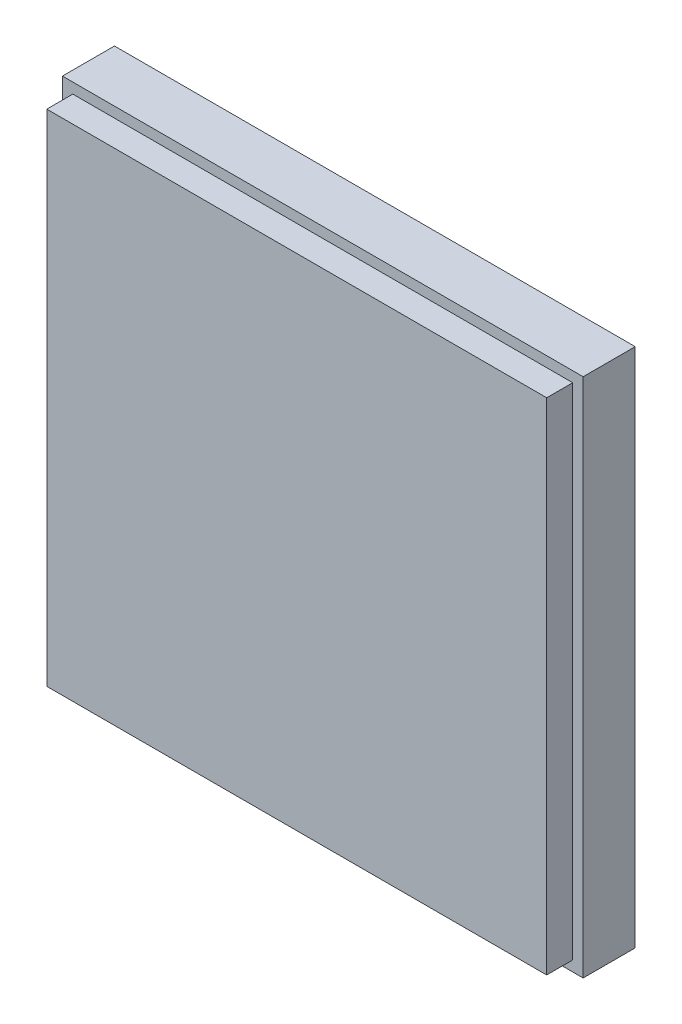
ISO-10303-21;
HEADER;
FILE_DESCRIPTION(('STEP AP214'),'2;1');
FILE_NAME('part.step','',(''),(''),'','','');
FILE_SCHEMA(('AUTOMOTIVE_DESIGN { 1 0 10303 214 1 1 1 1 }'));
ENDSEC;
DATA;
#1=APPLICATION_CONTEXT('core data for automotive mechanical design processes');
#2=APPLICATION_PROTOCOL_DEFINITION('international standard','automotive_design',2000,#1);
#3=PRODUCT_CONTEXT('',#1,'mechanical');
#4=PRODUCT('Part','Part','',(#3));
#5=PRODUCT_RELATED_PRODUCT_CATEGORY('part','',(#4));
#6=PRODUCT_DEFINITION_FORMATION('','',#4);
#7=PRODUCT_DEFINITION_CONTEXT('part definition',#1,'design');
#8=PRODUCT_DEFINITION('design','',#6,#7);
#9=PRODUCT_DEFINITION_SHAPE('','',#8);
#10=(LENGTH_UNIT() NAMED_UNIT(*) SI_UNIT(.MILLI.,.METRE.));
#11=(NAMED_UNIT(*) PLANE_ANGLE_UNIT() SI_UNIT($,.RADIAN.));
#12=(NAMED_UNIT(*) SI_UNIT($,.STERADIAN.) SOLID_ANGLE_UNIT());
#13=UNCERTAINTY_MEASURE_WITH_UNIT(LENGTH_MEASURE(1.E-05),#10,'distance_accuracy_value','');
#14=(GEOMETRIC_REPRESENTATION_CONTEXT(3) GLOBAL_UNCERTAINTY_ASSIGNED_CONTEXT((#13)) GLOBAL_UNIT_ASSIGNED_CONTEXT((#10,
#11,#12)) REPRESENTATION_CONTEXT('',''));
#15=CARTESIAN_POINT('',(0.,0.,0.));
#16=DIRECTION('',(0.,0.,1.));
#17=DIRECTION('',(1.,0.,0.));
#18=AXIS2_PLACEMENT_3D('',#15,#16,#17);
#19=CARTESIAN_POINT('',(-53.0668127053669,32.2015334063527,10.));
#20=DIRECTION('',(1.,0.,0.));
#21=DIRECTION('',(0.,1.,0.));
#22=AXIS2_PLACEMENT_3D('',#19,#20,#21);
#23=PLANE('',#22);
#24=DIRECTION('',(0.,-1.,0.));
#25=VECTOR('',#24,1.);
#26=CARTESIAN_POINT('',(-53.0668127053669,32.2015334063527,0.));
#27=LINE('',#26,#25);
#28=CARTESIAN_POINT('',(-53.0668127053669,32.2015334063527,0.));
#29=VERTEX_POINT('',#28);
#30=CARTESIAN_POINT('',(-53.0668127053669,-67.7984665936473,0.));
#31=VERTEX_POINT('',#30);
#32=EDGE_CURVE('E124',#29,#31,#27,.T.);
#33=ORIENTED_EDGE('',*,*,#32,.T.);
#34=DIRECTION('',(0.,0.,-1.));
#35=VECTOR('',#34,1.);
#36=CARTESIAN_POINT('',(-53.0668127053669,-67.7984665936473,10.));
#37=LINE('',#36,#35);
#38=CARTESIAN_POINT('',(-53.0668127053669,-67.7984665936473,10.));
#39=VERTEX_POINT('',#38);
#40=EDGE_CURVE('E11',#39,#31,#37,.T.);
#41=ORIENTED_EDGE('',*,*,#40,.F.);
#42=DIRECTION('',(0.,-1.,0.));
#43=VECTOR('',#42,1.);
#44=CARTESIAN_POINT('',(-53.0668127053669,32.2015334063527,10.));
#45=LINE('',#44,#43);
#46=CARTESIAN_POINT('',(-53.0668127053669,32.2015334063527,10.));
#47=VERTEX_POINT('',#46);
#48=EDGE_CURVE('E133',#47,#39,#45,.T.);
#49=ORIENTED_EDGE('',*,*,#48,.F.);
#50=DIRECTION('',(0.,0.,-1.));
#51=VECTOR('',#50,1.);
#52=CARTESIAN_POINT('',(-53.0668127053669,32.2015334063527,10.));
#53=LINE('',#52,#51);
#54=EDGE_CURVE('E142',#47,#29,#53,.T.);
#55=ORIENTED_EDGE('',*,*,#54,.T.);
#56=EDGE_LOOP('',(#33,#41,#49,#55));
#57=FACE_BOUND('',#56,.T.);
#58=ADVANCED_FACE('F39',(#57),#23,.F.);
#59=CARTESIAN_POINT('',(-53.0668127053669,-67.7984665936473,10.));
#60=DIRECTION('',(0.,1.,0.));
#61=DIRECTION('',(0.,0.,1.));
#62=AXIS2_PLACEMENT_3D('',#59,#60,#61);
#63=PLANE('',#62);
#64=DIRECTION('',(1.,0.,0.));
#65=VECTOR('',#64,1.);
#66=CARTESIAN_POINT('',(-53.0668127053669,-67.7984665936473,0.));
#67=LINE('',#66,#65);
#68=CARTESIAN_POINT('',(46.9331872946331,-67.7984665936473,0.));
#69=VERTEX_POINT('',#68);
#70=EDGE_CURVE('E127',#31,#69,#67,.T.);
#71=ORIENTED_EDGE('',*,*,#70,.T.);
#72=DIRECTION('',(0.,0.,-1.));
#73=VECTOR('',#72,1.);
#74=CARTESIAN_POINT('',(46.9331872946331,-67.7984665936473,10.));
#75=LINE('',#74,#73);
#76=CARTESIAN_POINT('',(46.9331872946331,-67.7984665936473,10.));
#77=VERTEX_POINT('',#76);
#78=EDGE_CURVE('E46',#77,#69,#75,.T.);
#79=ORIENTED_EDGE('',*,*,#78,.F.);
#80=DIRECTION('',(1.,0.,0.));
#81=VECTOR('',#80,1.);
#82=CARTESIAN_POINT('',(-53.0668127053669,-67.7984665936473,10.));
#83=LINE('',#82,#81);
#84=EDGE_CURVE('E136',#39,#77,#83,.T.);
#85=ORIENTED_EDGE('',*,*,#84,.F.);
#86=ORIENTED_EDGE('',*,*,#40,.T.);
#87=EDGE_LOOP('',(#71,#79,#85,#86));
#88=FACE_BOUND('',#87,.T.);
#89=ADVANCED_FACE('F173',(#88),#63,.F.);
#90=CARTESIAN_POINT('',(46.9331872946331,32.2015334063527,10.));
#91=DIRECTION('',(-1.,0.,0.));
#92=DIRECTION('',(0.,-1.,0.));
#93=AXIS2_PLACEMENT_3D('',#90,#91,#92);
#94=PLANE('',#93);
#95=DIRECTION('',(0.,1.,0.));
#96=VECTOR('',#95,1.);
#97=CARTESIAN_POINT('',(46.9331872946331,32.2015334063527,0.));
#98=LINE('',#97,#96);
#99=CARTESIAN_POINT('',(46.9331872946331,32.2015334063527,0.));
#100=VERTEX_POINT('',#99);
#101=EDGE_CURVE('E145',#69,#100,#98,.T.);
#102=ORIENTED_EDGE('',*,*,#101,.T.);
#103=DIRECTION('',(0.,0.,-1.));
#104=VECTOR('',#103,1.);
#105=CARTESIAN_POINT('',(46.9331872946331,32.2015334063527,10.));
#106=LINE('',#105,#104);
#107=CARTESIAN_POINT('',(46.9331872946331,32.2015334063527,10.));
#108=VERTEX_POINT('',#107);
#109=EDGE_CURVE('E150',#108,#100,#106,.T.);
#110=ORIENTED_EDGE('',*,*,#109,.F.);
#111=DIRECTION('',(0.,1.,0.));
#112=VECTOR('',#111,1.);
#113=CARTESIAN_POINT('',(46.9331872946331,32.2015334063527,10.));
#114=LINE('',#113,#112);
#115=EDGE_CURVE('E139',#77,#108,#114,.T.);
#116=ORIENTED_EDGE('',*,*,#115,.F.);
#117=ORIENTED_EDGE('',*,*,#78,.T.);
#118=EDGE_LOOP('',(#102,#110,#116,#117));
#119=FACE_BOUND('',#118,.T.);
#120=ADVANCED_FACE('F157',(#119),#94,.F.);
#121=CARTESIAN_POINT('',(-53.0668127053669,32.2015334063527,10.));
#122=DIRECTION('',(0.,-1.,0.));
#123=DIRECTION('',(0.,0.,-1.));
#124=AXIS2_PLACEMENT_3D('',#121,#122,#123);
#125=PLANE('',#124);
#126=DIRECTION('',(-1.,0.,0.));
#127=VECTOR('',#126,1.);
#128=CARTESIAN_POINT('',(-53.0668127053669,32.2015334063527,0.));
#129=LINE('',#128,#127);
#130=EDGE_CURVE('E137',#100,#29,#129,.T.);
#131=ORIENTED_EDGE('',*,*,#130,.T.);
#132=ORIENTED_EDGE('',*,*,#54,.F.);
#133=DIRECTION('',(-1.,0.,0.));
#134=VECTOR('',#133,1.);
#135=CARTESIAN_POINT('',(-53.0668127053669,32.2015334063527,10.));
#136=LINE('',#135,#134);
#137=EDGE_CURVE('E141',#108,#47,#136,.T.);
#138=ORIENTED_EDGE('',*,*,#137,.F.);
#139=ORIENTED_EDGE('',*,*,#109,.T.);
#140=EDGE_LOOP('',(#131,#132,#138,#139));
#141=FACE_BOUND('',#140,.T.);
#142=ADVANCED_FACE('F166',(#141),#125,.F.);
#143=CARTESIAN_POINT('',(0.,0.,10.));
#144=DIRECTION('',(0.,0.,1.));
#145=DIRECTION('',(1.,0.,0.));
#146=AXIS2_PLACEMENT_3D('',#143,#144,#145);
#147=PLANE('',#146);
#148=DIRECTION('',(0.,-1.,0.));
#149=VECTOR('',#148,1.);
#150=CARTESIAN_POINT('',(-51.0668127053669,30.2015334063527,10.));
#151=LINE('',#150,#149);
#152=CARTESIAN_POINT('',(-51.0668127053669,30.2015334063527,10.));
#153=VERTEX_POINT('',#152);
#154=CARTESIAN_POINT('',(-51.0668127053669,-65.7984665936473,10.));
#155=VERTEX_POINT('',#154);
#156=EDGE_CURVE('E53',#153,#155,#151,.T.);
#157=ORIENTED_EDGE('',*,*,#156,.F.);
#158=DIRECTION('',(1.,0.,0.));
#159=VECTOR('',#158,1.);
#160=CARTESIAN_POINT('',(-51.0668127053669,30.2015334063527,10.));
#161=LINE('',#160,#159);
#162=CARTESIAN_POINT('',(44.9331872946331,30.2015334063527,10.));
#163=VERTEX_POINT('',#162);
#164=EDGE_CURVE('E58',#153,#163,#161,.T.);
#165=ORIENTED_EDGE('',*,*,#164,.T.);
#166=DIRECTION('',(0.,-1.,0.));
#167=VECTOR('',#166,1.);
#168=CARTESIAN_POINT('',(44.9331872946331,30.2015334063527,10.));
#169=LINE('',#168,#167);
#170=CARTESIAN_POINT('',(44.9331872946331,-65.7984665936473,10.));
#171=VERTEX_POINT('',#170);
#172=EDGE_CURVE('E266',#163,#171,#169,.T.);
#173=ORIENTED_EDGE('',*,*,#172,.T.);
#174=DIRECTION('',(1.,0.,0.));
#175=VECTOR('',#174,1.);
#176=CARTESIAN_POINT('',(-51.0668127053669,-65.7984665936473,10.));
#177=LINE('',#176,#175);
#178=EDGE_CURVE('E268',#155,#171,#177,.T.);
#179=ORIENTED_EDGE('',*,*,#178,.F.);
#180=EDGE_LOOP('',(#157,#165,#173,#179));
#181=FACE_BOUND('',#180,.T.);
#182=ORIENTED_EDGE('',*,*,#48,.T.);
#183=ORIENTED_EDGE('',*,*,#84,.T.);
#184=ORIENTED_EDGE('',*,*,#115,.T.);
#185=ORIENTED_EDGE('',*,*,#137,.T.);
#186=EDGE_LOOP('',(#182,#183,#184,#185));
#187=FACE_BOUND('',#186,.T.);
#188=ADVANCED_FACE('F172',(#181,#187),#147,.T.);
#189=CARTESIAN_POINT('',(0.,0.,0.));
#190=DIRECTION('',(0.,0.,1.));
#191=DIRECTION('',(1.,0.,0.));
#192=AXIS2_PLACEMENT_3D('',#189,#190,#191);
#193=PLANE('',#192);
#194=ORIENTED_EDGE('',*,*,#32,.F.);
#195=ORIENTED_EDGE('',*,*,#130,.F.);
#196=ORIENTED_EDGE('',*,*,#101,.F.);
#197=ORIENTED_EDGE('',*,*,#70,.F.);
#198=EDGE_LOOP('',(#194,#195,#196,#197));
#199=FACE_BOUND('',#198,.T.);
#200=ADVANCED_FACE('F163',(#199),#193,.F.);
#201=CARTESIAN_POINT('',(-51.0668127053669,30.2015334063527,15.));
#202=DIRECTION('',(1.,0.,0.));
#203=DIRECTION('',(0.,1.,0.));
#204=AXIS2_PLACEMENT_3D('',#201,#202,#203);
#205=PLANE('',#204);
#206=ORIENTED_EDGE('',*,*,#156,.T.);
#207=DIRECTION('',(0.,0.,-1.));
#208=VECTOR('',#207,1.);
#209=CARTESIAN_POINT('',(-51.0668127053669,-65.7984665936473,15.));
#210=LINE('',#209,#208);
#211=CARTESIAN_POINT('',(-51.0668127053669,-65.7984665936473,15.));
#212=VERTEX_POINT('',#211);
#213=EDGE_CURVE('E107',#212,#155,#210,.T.);
#214=ORIENTED_EDGE('',*,*,#213,.F.);
#215=DIRECTION('',(0.,-1.,0.));
#216=VECTOR('',#215,1.);
#217=CARTESIAN_POINT('',(-51.0668127053669,30.2015334063527,15.));
#218=LINE('',#217,#216);
#219=CARTESIAN_POINT('',(-51.0668127053669,30.2015334063527,15.));
#220=VERTEX_POINT('',#219);
#221=EDGE_CURVE('E114',#220,#212,#218,.T.);
#222=ORIENTED_EDGE('',*,*,#221,.F.);
#223=DIRECTION('',(0.,0.,-1.));
#224=VECTOR('',#223,1.);
#225=CARTESIAN_POINT('',(-51.0668127053669,30.2015334063527,15.));
#226=LINE('',#225,#224);
#227=EDGE_CURVE('E264',#220,#153,#226,.T.);
#228=ORIENTED_EDGE('',*,*,#227,.T.);
#229=EDGE_LOOP('',(#206,#214,#222,#228));
#230=FACE_BOUND('',#229,.T.);
#231=ADVANCED_FACE('F123',(#230),#205,.F.);
#232=CARTESIAN_POINT('',(-51.0668127053669,-65.7984665936473,15.));
#233=DIRECTION('',(0.,1.,0.));
#234=DIRECTION('',(0.,0.,1.));
#235=AXIS2_PLACEMENT_3D('',#232,#233,#234);
#236=PLANE('',#235);
#237=ORIENTED_EDGE('',*,*,#178,.T.);
#238=DIRECTION('',(0.,0.,-1.));
#239=VECTOR('',#238,1.);
#240=CARTESIAN_POINT('',(44.9331872946331,-65.7984665936473,15.));
#241=LINE('',#240,#239);
#242=CARTESIAN_POINT('',(44.9331872946331,-65.7984665936473,15.));
#243=VERTEX_POINT('',#242);
#244=EDGE_CURVE('E109',#243,#171,#241,.T.);
#245=ORIENTED_EDGE('',*,*,#244,.F.);
#246=DIRECTION('',(1.,0.,0.));
#247=VECTOR('',#246,1.);
#248=CARTESIAN_POINT('',(-51.0668127053669,-65.7984665936473,15.));
#249=LINE('',#248,#247);
#250=EDGE_CURVE('E102',#212,#243,#249,.T.);
#251=ORIENTED_EDGE('',*,*,#250,.F.);
#252=ORIENTED_EDGE('',*,*,#213,.T.);
#253=EDGE_LOOP('',(#237,#245,#251,#252));
#254=FACE_BOUND('',#253,.T.);
#255=ADVANCED_FACE('F105',(#254),#236,.F.);
#256=CARTESIAN_POINT('',(44.9331872946331,30.2015334063527,15.));
#257=DIRECTION('',(1.,0.,0.));
#258=DIRECTION('',(0.,1.,0.));
#259=AXIS2_PLACEMENT_3D('',#256,#257,#258);
#260=PLANE('',#259);
#261=ORIENTED_EDGE('',*,*,#172,.F.);
#262=DIRECTION('',(0.,0.,-1.));
#263=VECTOR('',#262,1.);
#264=CARTESIAN_POINT('',(44.9331872946331,30.2015334063527,15.));
#265=LINE('',#264,#263);
#266=CARTESIAN_POINT('',(44.9331872946331,30.2015334063527,15.));
#267=VERTEX_POINT('',#266);
#268=EDGE_CURVE('E129',#267,#163,#265,.T.);
#269=ORIENTED_EDGE('',*,*,#268,.F.);
#270=DIRECTION('',(0.,-1.,0.));
#271=VECTOR('',#270,1.);
#272=CARTESIAN_POINT('',(44.9331872946331,30.2015334063527,15.));
#273=LINE('',#272,#271);
#274=EDGE_CURVE('E113',#267,#243,#273,.T.);
#275=ORIENTED_EDGE('',*,*,#274,.T.);
#276=ORIENTED_EDGE('',*,*,#244,.T.);
#277=EDGE_LOOP('',(#261,#269,#275,#276));
#278=FACE_BOUND('',#277,.T.);
#279=ADVANCED_FACE('F191',(#278),#260,.T.);
#280=CARTESIAN_POINT('',(-51.0668127053669,30.2015334063527,15.));
#281=DIRECTION('',(0.,1.,0.));
#282=DIRECTION('',(0.,0.,1.));
#283=AXIS2_PLACEMENT_3D('',#280,#281,#282);
#284=PLANE('',#283);
#285=ORIENTED_EDGE('',*,*,#164,.F.);
#286=ORIENTED_EDGE('',*,*,#227,.F.);
#287=DIRECTION('',(1.,0.,0.));
#288=VECTOR('',#287,1.);
#289=CARTESIAN_POINT('',(-51.0668127053669,30.2015334063527,15.));
#290=LINE('',#289,#288);
#291=EDGE_CURVE('E120',#220,#267,#290,.T.);
#292=ORIENTED_EDGE('',*,*,#291,.T.);
#293=ORIENTED_EDGE('',*,*,#268,.T.);
#294=EDGE_LOOP('',(#285,#286,#292,#293));
#295=FACE_BOUND('',#294,.T.);
#296=ADVANCED_FACE('F194',(#295),#284,.T.);
#297=CARTESIAN_POINT('',(0.,0.,15.));
#298=DIRECTION('',(0.,0.,1.));
#299=DIRECTION('',(1.,0.,0.));
#300=AXIS2_PLACEMENT_3D('',#297,#298,#299);
#301=PLANE('',#300);
#302=ORIENTED_EDGE('',*,*,#221,.T.);
#303=ORIENTED_EDGE('',*,*,#250,.T.);
#304=ORIENTED_EDGE('',*,*,#274,.F.);
#305=ORIENTED_EDGE('',*,*,#291,.F.);
#306=EDGE_LOOP('',(#302,#303,#304,#305));
#307=FACE_BOUND('',#306,.T.);
#308=ADVANCED_FACE('F118',(#307),#301,.T.);
#309=CLOSED_SHELL('',(#58,#89,#120,#142,#188,#200,#231,#255,#279,#296,#308));
#310=MANIFOLD_SOLID_BREP('B2',#309);
#311=ADVANCED_BREP_SHAPE_REPRESENTATION('',(#18,#310),#14);
#312=SHAPE_DEFINITION_REPRESENTATION(#9,#311);
ENDSEC;
END-ISO-10303-21;
